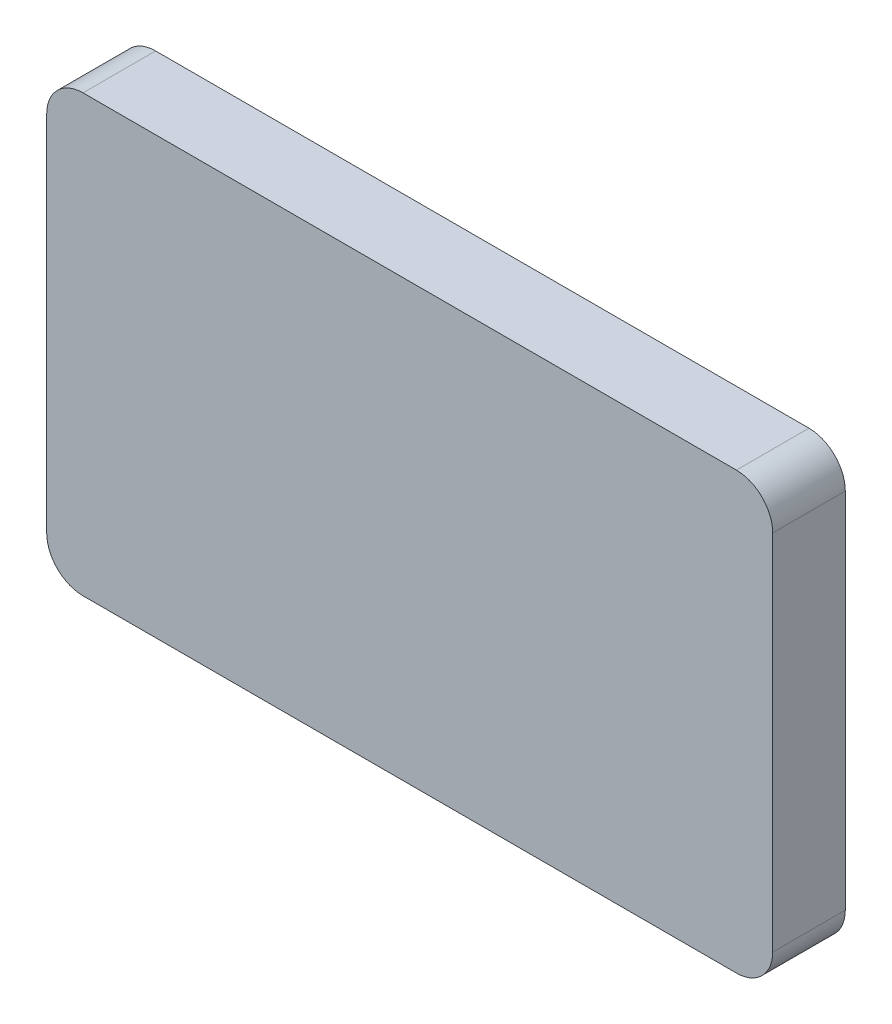
ISO-10303-21;
HEADER;
FILE_DESCRIPTION(('STEP AP214'),'2;1');
FILE_NAME('part.step','',(''),(''),'','','');
FILE_SCHEMA(('AUTOMOTIVE_DESIGN { 1 0 10303 214 1 1 1 1 }'));
ENDSEC;
DATA;
#1=APPLICATION_CONTEXT('core data for automotive mechanical design processes');
#2=APPLICATION_PROTOCOL_DEFINITION('international standard','automotive_design',2000,#1);
#3=PRODUCT_CONTEXT('',#1,'mechanical');
#4=PRODUCT('Part','Part','',(#3));
#5=PRODUCT_RELATED_PRODUCT_CATEGORY('part','',(#4));
#6=PRODUCT_DEFINITION_FORMATION('','',#4);
#7=PRODUCT_DEFINITION_CONTEXT('part definition',#1,'design');
#8=PRODUCT_DEFINITION('design','',#6,#7);
#9=PRODUCT_DEFINITION_SHAPE('','',#8);
#10=(LENGTH_UNIT() NAMED_UNIT(*) SI_UNIT(.MILLI.,.METRE.));
#11=(NAMED_UNIT(*) PLANE_ANGLE_UNIT() SI_UNIT($,.RADIAN.));
#12=(NAMED_UNIT(*) SI_UNIT($,.STERADIAN.) SOLID_ANGLE_UNIT());
#13=UNCERTAINTY_MEASURE_WITH_UNIT(LENGTH_MEASURE(1.E-05),#10,'distance_accuracy_value','');
#14=(GEOMETRIC_REPRESENTATION_CONTEXT(3) GLOBAL_UNCERTAINTY_ASSIGNED_CONTEXT((#13)) GLOBAL_UNIT_ASSIGNED_CONTEXT((#10,
#11,#12)) REPRESENTATION_CONTEXT('',''));
#15=CARTESIAN_POINT('',(0.,0.,0.));
#16=DIRECTION('',(0.,0.,1.));
#17=DIRECTION('',(1.,0.,0.));
#18=AXIS2_PLACEMENT_3D('',#15,#16,#17);
#19=CARTESIAN_POINT('',(63.5,-38.1,12.7));
#20=DIRECTION('',(-1.,0.,0.));
#21=DIRECTION('',(0.,0.,1.));
#22=AXIS2_PLACEMENT_3D('',#19,#20,#21);
#23=PLANE('',#22);
#24=DIRECTION('',(0.,1.,0.));
#25=VECTOR('',#24,1.);
#26=CARTESIAN_POINT('',(63.5,-38.1,12.7));
#27=LINE('',#26,#25);
#28=CARTESIAN_POINT('',(63.5,-31.75,12.7));
#29=VERTEX_POINT('',#28);
#30=CARTESIAN_POINT('',(63.5,31.75,12.7));
#31=VERTEX_POINT('',#30);
#32=EDGE_CURVE('E129',#29,#31,#27,.T.);
#33=ORIENTED_EDGE('',*,*,#32,.F.);
#34=DIRECTION('',(0.,0.,-1.));
#35=VECTOR('',#34,1.);
#36=CARTESIAN_POINT('',(63.5,-31.75,12.7));
#37=LINE('',#36,#35);
#38=CARTESIAN_POINT('',(63.5,-31.75,0.));
#39=VERTEX_POINT('',#38);
#40=EDGE_CURVE('E155',#29,#39,#37,.T.);
#41=ORIENTED_EDGE('',*,*,#40,.T.);
#42=DIRECTION('',(0.,1.,0.));
#43=VECTOR('',#42,1.);
#44=CARTESIAN_POINT('',(63.5,-38.1,0.));
#45=LINE('',#44,#43);
#46=CARTESIAN_POINT('',(63.5,31.75,0.));
#47=VERTEX_POINT('',#46);
#48=EDGE_CURVE('E161',#39,#47,#45,.T.);
#49=ORIENTED_EDGE('',*,*,#48,.T.);
#50=DIRECTION('',(0.,0.,-1.));
#51=VECTOR('',#50,1.);
#52=CARTESIAN_POINT('',(63.5,31.75,12.7));
#53=LINE('',#52,#51);
#54=EDGE_CURVE('E153',#47,#31,#53,.F.);
#55=ORIENTED_EDGE('',*,*,#54,.T.);
#56=EDGE_LOOP('',(#33,#41,#49,#55));
#57=FACE_BOUND('',#56,.T.);
#58=ADVANCED_FACE('F37',(#57),#23,.F.);
#59=CARTESIAN_POINT('',(-63.5,38.1,12.7));
#60=DIRECTION('',(0.,-1.,0.));
#61=DIRECTION('',(0.,0.,-1.));
#62=AXIS2_PLACEMENT_3D('',#59,#60,#61);
#63=PLANE('',#62);
#64=DIRECTION('',(-1.,0.,0.));
#65=VECTOR('',#64,1.);
#66=CARTESIAN_POINT('',(-63.5,38.1,12.7));
#67=LINE('',#66,#65);
#68=CARTESIAN_POINT('',(57.15,38.1,12.7));
#69=VERTEX_POINT('',#68);
#70=CARTESIAN_POINT('',(-57.15,38.1,12.7));
#71=VERTEX_POINT('',#70);
#72=EDGE_CURVE('E132',#69,#71,#67,.T.);
#73=ORIENTED_EDGE('',*,*,#72,.F.);
#74=DIRECTION('',(0.,0.,-1.));
#75=VECTOR('',#74,1.);
#76=CARTESIAN_POINT('',(57.15,38.1,12.7));
#77=LINE('',#76,#75);
#78=CARTESIAN_POINT('',(57.15,38.1,0.));
#79=VERTEX_POINT('',#78);
#80=EDGE_CURVE('E11',#69,#79,#77,.T.);
#81=ORIENTED_EDGE('',*,*,#80,.T.);
#82=DIRECTION('',(-1.,0.,0.));
#83=VECTOR('',#82,1.);
#84=CARTESIAN_POINT('',(-63.5,38.1,0.));
#85=LINE('',#84,#83);
#86=CARTESIAN_POINT('',(-57.15,38.1,0.));
#87=VERTEX_POINT('',#86);
#88=EDGE_CURVE('E134',#79,#87,#85,.T.);
#89=ORIENTED_EDGE('',*,*,#88,.T.);
#90=DIRECTION('',(0.,0.,-1.));
#91=VECTOR('',#90,1.);
#92=CARTESIAN_POINT('',(-57.15,38.1,12.7));
#93=LINE('',#92,#91);
#94=EDGE_CURVE('E45',#87,#71,#93,.F.);
#95=ORIENTED_EDGE('',*,*,#94,.T.);
#96=EDGE_LOOP('',(#73,#81,#89,#95));
#97=FACE_BOUND('',#96,.T.);
#98=ADVANCED_FACE('F180',(#97),#63,.F.);
#99=CARTESIAN_POINT('',(-63.5,-38.1,12.7));
#100=DIRECTION('',(1.,0.,0.));
#101=DIRECTION('',(0.,0.,-1.));
#102=AXIS2_PLACEMENT_3D('',#99,#100,#101);
#103=PLANE('',#102);
#104=DIRECTION('',(0.,-1.,0.));
#105=VECTOR('',#104,1.);
#106=CARTESIAN_POINT('',(-63.5,-38.1,0.));
#107=LINE('',#106,#105);
#108=CARTESIAN_POINT('',(-63.5,31.75,0.));
#109=VERTEX_POINT('',#108);
#110=CARTESIAN_POINT('',(-63.5,-31.75,0.));
#111=VERTEX_POINT('',#110);
#112=EDGE_CURVE('E130',#109,#111,#107,.T.);
#113=ORIENTED_EDGE('',*,*,#112,.T.);
#114=DIRECTION('',(0.,0.,-1.));
#115=VECTOR('',#114,1.);
#116=CARTESIAN_POINT('',(-63.5,-31.75,12.7));
#117=LINE('',#116,#115);
#118=CARTESIAN_POINT('',(-63.5,-31.75,12.7));
#119=VERTEX_POINT('',#118);
#120=EDGE_CURVE('E108',#111,#119,#117,.F.);
#121=ORIENTED_EDGE('',*,*,#120,.T.);
#122=DIRECTION('',(0.,-1.,0.));
#123=VECTOR('',#122,1.);
#124=CARTESIAN_POINT('',(-63.5,-38.1,12.7));
#125=LINE('',#124,#123);
#126=CARTESIAN_POINT('',(-63.5,31.75,12.7));
#127=VERTEX_POINT('',#126);
#128=EDGE_CURVE('E169',#127,#119,#125,.T.);
#129=ORIENTED_EDGE('',*,*,#128,.F.);
#130=DIRECTION('',(0.,0.,-1.));
#131=VECTOR('',#130,1.);
#132=CARTESIAN_POINT('',(-63.5,31.75,12.7));
#133=LINE('',#132,#131);
#134=EDGE_CURVE('E113',#127,#109,#133,.T.);
#135=ORIENTED_EDGE('',*,*,#134,.T.);
#136=EDGE_LOOP('',(#113,#121,#129,#135));
#137=FACE_BOUND('',#136,.T.);
#138=ADVANCED_FACE('F179',(#137),#103,.F.);
#139=CARTESIAN_POINT('',(-63.5,-38.1,12.7));
#140=DIRECTION('',(0.,1.,0.));
#141=DIRECTION('',(0.,0.,1.));
#142=AXIS2_PLACEMENT_3D('',#139,#140,#141);
#143=PLANE('',#142);
#144=DIRECTION('',(1.,0.,0.));
#145=VECTOR('',#144,1.);
#146=CARTESIAN_POINT('',(-63.5,-38.1,12.7));
#147=LINE('',#146,#145);
#148=CARTESIAN_POINT('',(-57.15,-38.1,12.7));
#149=VERTEX_POINT('',#148);
#150=CARTESIAN_POINT('',(57.15,-38.1,12.7));
#151=VERTEX_POINT('',#150);
#152=EDGE_CURVE('E123',#149,#151,#147,.T.);
#153=ORIENTED_EDGE('',*,*,#152,.F.);
#154=DIRECTION('',(0.,0.,-1.));
#155=VECTOR('',#154,1.);
#156=CARTESIAN_POINT('',(-57.15,-38.1,12.7));
#157=LINE('',#156,#155);
#158=CARTESIAN_POINT('',(-57.15,-38.1,0.));
#159=VERTEX_POINT('',#158);
#160=EDGE_CURVE('E107',#149,#159,#157,.T.);
#161=ORIENTED_EDGE('',*,*,#160,.T.);
#162=DIRECTION('',(1.,0.,0.));
#163=VECTOR('',#162,1.);
#164=CARTESIAN_POINT('',(-63.5,-38.1,0.));
#165=LINE('',#164,#163);
#166=CARTESIAN_POINT('',(57.15,-38.1,0.));
#167=VERTEX_POINT('',#166);
#168=EDGE_CURVE('E120',#159,#167,#165,.T.);
#169=ORIENTED_EDGE('',*,*,#168,.T.);
#170=DIRECTION('',(0.,0.,-1.));
#171=VECTOR('',#170,1.);
#172=CARTESIAN_POINT('',(57.15,-38.1,12.7));
#173=LINE('',#172,#171);
#174=EDGE_CURVE('E125',#167,#151,#173,.F.);
#175=ORIENTED_EDGE('',*,*,#174,.T.);
#176=EDGE_LOOP('',(#153,#161,#169,#175));
#177=FACE_BOUND('',#176,.T.);
#178=ADVANCED_FACE('F119',(#177),#143,.F.);
#179=CARTESIAN_POINT('',(0.,0.,12.7));
#180=DIRECTION('',(0.,0.,-1.));
#181=DIRECTION('',(-1.,0.,0.));
#182=AXIS2_PLACEMENT_3D('',#179,#180,#181);
#183=PLANE('',#182);
#184=ORIENTED_EDGE('',*,*,#128,.T.);
#185=CARTESIAN_POINT('',(-57.15,-31.75,12.7));
#186=DIRECTION('',(0.,0.,-1.));
#187=DIRECTION('',(-1.,0.,0.));
#188=AXIS2_PLACEMENT_3D('',#185,#186,#187);
#189=CIRCLE('',#188,6.35);
#190=EDGE_CURVE('E151',#119,#149,#189,.F.);
#191=ORIENTED_EDGE('',*,*,#190,.T.);
#192=ORIENTED_EDGE('',*,*,#152,.T.);
#193=CARTESIAN_POINT('',(57.15,-31.75,12.7));
#194=DIRECTION('',(0.,0.,-1.));
#195=DIRECTION('',(-1.,0.,0.));
#196=AXIS2_PLACEMENT_3D('',#193,#194,#195);
#197=CIRCLE('',#196,6.35);
#198=EDGE_CURVE('E149',#151,#29,#197,.F.);
#199=ORIENTED_EDGE('',*,*,#198,.T.);
#200=ORIENTED_EDGE('',*,*,#32,.T.);
#201=CARTESIAN_POINT('',(57.15,31.75,12.7));
#202=DIRECTION('',(0.,0.,-1.));
#203=DIRECTION('',(-1.,0.,0.));
#204=AXIS2_PLACEMENT_3D('',#201,#202,#203);
#205=CIRCLE('',#204,6.35);
#206=EDGE_CURVE('E58',#31,#69,#205,.F.);
#207=ORIENTED_EDGE('',*,*,#206,.T.);
#208=ORIENTED_EDGE('',*,*,#72,.T.);
#209=CARTESIAN_POINT('',(-57.15,31.75,12.7));
#210=DIRECTION('',(0.,0.,-1.));
#211=DIRECTION('',(-1.,0.,0.));
#212=AXIS2_PLACEMENT_3D('',#209,#210,#211);
#213=CIRCLE('',#212,6.35);
#214=EDGE_CURVE('E146',#71,#127,#213,.F.);
#215=ORIENTED_EDGE('',*,*,#214,.T.);
#216=EDGE_LOOP('',(#184,#191,#192,#199,#200,#207,#208,#215));
#217=FACE_BOUND('',#216,.T.);
#218=ADVANCED_FACE('F173',(#217),#183,.F.);
#219=CARTESIAN_POINT('',(0.,0.,0.));
#220=DIRECTION('',(0.,0.,-1.));
#221=DIRECTION('',(-1.,0.,0.));
#222=AXIS2_PLACEMENT_3D('',#219,#220,#221);
#223=PLANE('',#222);
#224=ORIENTED_EDGE('',*,*,#168,.F.);
#225=CARTESIAN_POINT('',(-57.15,-31.75,0.));
#226=DIRECTION('',(0.,0.,-1.));
#227=DIRECTION('',(-1.,0.,0.));
#228=AXIS2_PLACEMENT_3D('',#225,#226,#227);
#229=CIRCLE('',#228,6.35);
#230=EDGE_CURVE('E103',#159,#111,#229,.T.);
#231=ORIENTED_EDGE('',*,*,#230,.T.);
#232=ORIENTED_EDGE('',*,*,#112,.F.);
#233=CARTESIAN_POINT('',(-57.15,31.75,0.));
#234=DIRECTION('',(0.,0.,-1.));
#235=DIRECTION('',(-1.,0.,0.));
#236=AXIS2_PLACEMENT_3D('',#233,#234,#235);
#237=CIRCLE('',#236,6.35);
#238=EDGE_CURVE('E124',#109,#87,#237,.T.);
#239=ORIENTED_EDGE('',*,*,#238,.T.);
#240=ORIENTED_EDGE('',*,*,#88,.F.);
#241=CARTESIAN_POINT('',(57.15,31.75,0.));
#242=DIRECTION('',(0.,0.,-1.));
#243=DIRECTION('',(-1.,0.,0.));
#244=AXIS2_PLACEMENT_3D('',#241,#242,#243);
#245=CIRCLE('',#244,6.35);
#246=EDGE_CURVE('E140',#79,#47,#245,.T.);
#247=ORIENTED_EDGE('',*,*,#246,.T.);
#248=ORIENTED_EDGE('',*,*,#48,.F.);
#249=CARTESIAN_POINT('',(57.15,-31.75,0.));
#250=DIRECTION('',(0.,0.,-1.));
#251=DIRECTION('',(-1.,0.,0.));
#252=AXIS2_PLACEMENT_3D('',#249,#250,#251);
#253=CIRCLE('',#252,6.35);
#254=EDGE_CURVE('E114',#39,#167,#253,.T.);
#255=ORIENTED_EDGE('',*,*,#254,.T.);
#256=EDGE_LOOP('',(#224,#231,#232,#239,#240,#247,#248,#255));
#257=FACE_BOUND('',#256,.T.);
#258=ADVANCED_FACE('F127',(#257),#223,.T.);
#259=CARTESIAN_POINT('',(-57.15,-31.75,12.7));
#260=DIRECTION('',(0.,0.,-1.));
#261=DIRECTION('',(-1.,0.,0.));
#262=AXIS2_PLACEMENT_3D('',#259,#260,#261);
#263=CYLINDRICAL_SURFACE('',#262,6.35);
#264=ORIENTED_EDGE('',*,*,#190,.F.);
#265=ORIENTED_EDGE('',*,*,#120,.F.);
#266=ORIENTED_EDGE('',*,*,#230,.F.);
#267=ORIENTED_EDGE('',*,*,#160,.F.);
#268=EDGE_LOOP('',(#264,#265,#266,#267));
#269=FACE_BOUND('',#268,.T.);
#270=ADVANCED_FACE('F106',(#269),#263,.T.);
#271=CARTESIAN_POINT('',(57.15,-31.75,12.7));
#272=DIRECTION('',(0.,0.,-1.));
#273=DIRECTION('',(-1.,0.,0.));
#274=AXIS2_PLACEMENT_3D('',#271,#272,#273);
#275=CYLINDRICAL_SURFACE('',#274,6.35);
#276=ORIENTED_EDGE('',*,*,#198,.F.);
#277=ORIENTED_EDGE('',*,*,#174,.F.);
#278=ORIENTED_EDGE('',*,*,#254,.F.);
#279=ORIENTED_EDGE('',*,*,#40,.F.);
#280=EDGE_LOOP('',(#276,#277,#278,#279));
#281=FACE_BOUND('',#280,.T.);
#282=ADVANCED_FACE('F183',(#281),#275,.T.);
#283=CARTESIAN_POINT('',(57.15,31.75,12.7));
#284=DIRECTION('',(0.,0.,-1.));
#285=DIRECTION('',(-1.,0.,0.));
#286=AXIS2_PLACEMENT_3D('',#283,#284,#285);
#287=CYLINDRICAL_SURFACE('',#286,6.35);
#288=ORIENTED_EDGE('',*,*,#206,.F.);
#289=ORIENTED_EDGE('',*,*,#54,.F.);
#290=ORIENTED_EDGE('',*,*,#246,.F.);
#291=ORIENTED_EDGE('',*,*,#80,.F.);
#292=EDGE_LOOP('',(#288,#289,#290,#291));
#293=FACE_BOUND('',#292,.T.);
#294=ADVANCED_FACE('F182',(#293),#287,.T.);
#295=CARTESIAN_POINT('',(-57.15,31.75,12.7));
#296=DIRECTION('',(0.,0.,-1.));
#297=DIRECTION('',(-1.,0.,0.));
#298=AXIS2_PLACEMENT_3D('',#295,#296,#297);
#299=CYLINDRICAL_SURFACE('',#298,6.35);
#300=ORIENTED_EDGE('',*,*,#214,.F.);
#301=ORIENTED_EDGE('',*,*,#94,.F.);
#302=ORIENTED_EDGE('',*,*,#238,.F.);
#303=ORIENTED_EDGE('',*,*,#134,.F.);
#304=EDGE_LOOP('',(#300,#301,#302,#303));
#305=FACE_BOUND('',#304,.T.);
#306=ADVANCED_FACE('F39',(#305),#299,.T.);
#307=CLOSED_SHELL('',(#58,#98,#138,#178,#218,#258,#270,#282,#294,#306));
#308=MANIFOLD_SOLID_BREP('B2',#307);
#309=ADVANCED_BREP_SHAPE_REPRESENTATION('',(#18,#308),#14);
#310=SHAPE_DEFINITION_REPRESENTATION(#9,#309);
ENDSEC;
END-ISO-10303-21;
